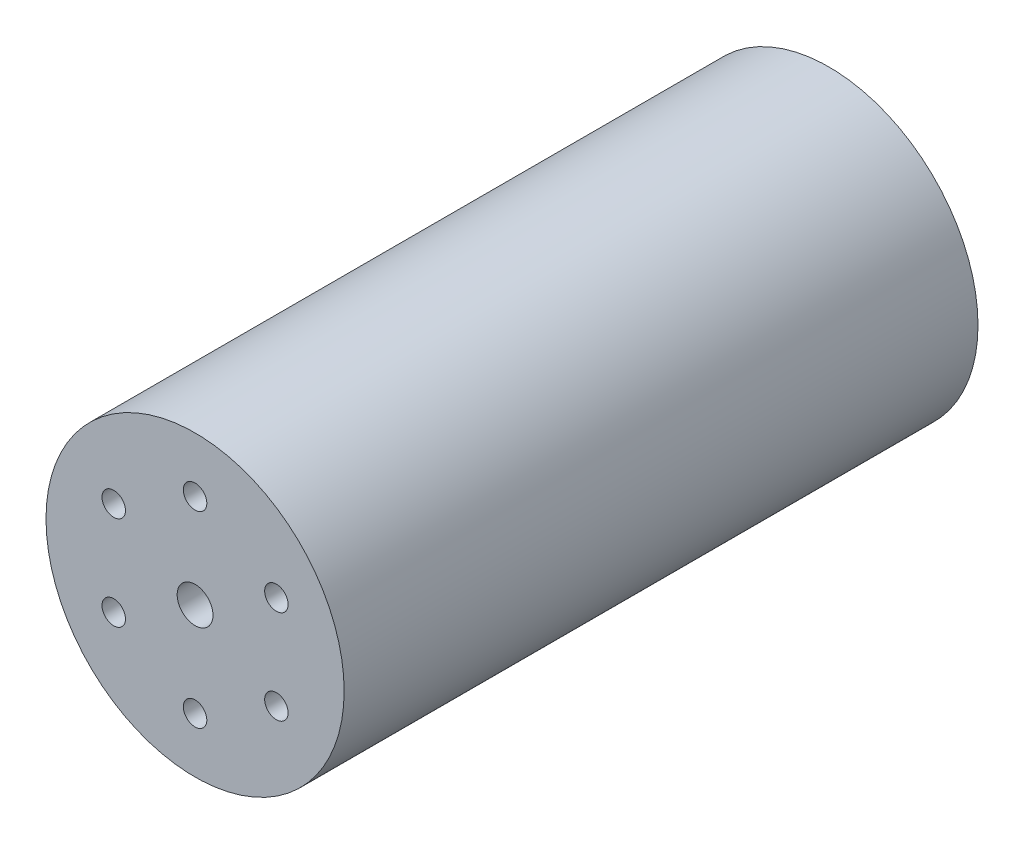
ISO-10303-21;
HEADER;
FILE_DESCRIPTION(('STEP AP214'),'2;1');
FILE_NAME('part.step','',(''),(''),'','','');
FILE_SCHEMA(('AUTOMOTIVE_DESIGN { 1 0 10303 214 1 1 1 1 }'));
ENDSEC;
DATA;
#1=APPLICATION_CONTEXT('core data for automotive mechanical design processes');
#2=APPLICATION_PROTOCOL_DEFINITION('international standard','automotive_design',2000,#1);
#3=PRODUCT_CONTEXT('',#1,'mechanical');
#4=PRODUCT('Part','Part','',(#3));
#5=PRODUCT_RELATED_PRODUCT_CATEGORY('part','',(#4));
#6=PRODUCT_DEFINITION_FORMATION('','',#4);
#7=PRODUCT_DEFINITION_CONTEXT('part definition',#1,'design');
#8=PRODUCT_DEFINITION('design','',#6,#7);
#9=PRODUCT_DEFINITION_SHAPE('','',#8);
#10=(LENGTH_UNIT() NAMED_UNIT(*) SI_UNIT(.MILLI.,.METRE.));
#11=(NAMED_UNIT(*) PLANE_ANGLE_UNIT() SI_UNIT($,.RADIAN.));
#12=(NAMED_UNIT(*) SI_UNIT($,.STERADIAN.) SOLID_ANGLE_UNIT());
#13=UNCERTAINTY_MEASURE_WITH_UNIT(LENGTH_MEASURE(1.E-05),#10,'distance_accuracy_value','');
#14=(GEOMETRIC_REPRESENTATION_CONTEXT(3) GLOBAL_UNCERTAINTY_ASSIGNED_CONTEXT((#13)) GLOBAL_UNIT_ASSIGNED_CONTEXT((#10,
#11,#12)) REPRESENTATION_CONTEXT('',''));
#15=CARTESIAN_POINT('',(0.,0.,0.));
#16=DIRECTION('',(0.,0.,1.));
#17=DIRECTION('',(1.,0.,0.));
#18=AXIS2_PLACEMENT_3D('',#15,#16,#17);
#19=CARTESIAN_POINT('',(0.,0.,135.));
#20=DIRECTION('',(0.,0.,-1.));
#21=DIRECTION('',(-1.,0.,0.));
#22=AXIS2_PLACEMENT_3D('',#19,#20,#21);
#23=CYLINDRICAL_SURFACE('',#22,3.815);
#24=CARTESIAN_POINT('',(0.,0.,135.));
#25=DIRECTION('',(0.,0.,-1.));
#26=DIRECTION('',(-1.,0.,0.));
#27=AXIS2_PLACEMENT_3D('',#24,#25,#26);
#28=CIRCLE('',#27,3.815);
#29=CARTESIAN_POINT('',(-3.815,0.,135.));
#30=VERTEX_POINT('',#29);
#31=EDGE_CURVE('E46',#30,#30,#28,.T.);
#32=ORIENTED_EDGE('',*,*,#31,.F.);
#33=EDGE_LOOP('',(#32));
#34=FACE_BOUND('',#33,.T.);
#35=CARTESIAN_POINT('',(0.,0.,30.));
#36=DIRECTION('',(0.,0.,-1.));
#37=DIRECTION('',(-1.,0.,0.));
#38=AXIS2_PLACEMENT_3D('',#35,#36,#37);
#39=CIRCLE('',#38,3.815);
#40=CARTESIAN_POINT('',(-3.815,0.,30.));
#41=VERTEX_POINT('',#40);
#42=EDGE_CURVE('E37',#41,#41,#39,.F.);
#43=ORIENTED_EDGE('',*,*,#42,.F.);
#44=EDGE_LOOP('',(#43));
#45=FACE_BOUND('',#44,.T.);
#46=ADVANCED_FACE('F33',(#34,#45),#23,.F.);
#47=CARTESIAN_POINT('',(0.,0.,135.));
#48=DIRECTION('',(0.,0.,-1.));
#49=DIRECTION('',(-1.,0.,0.));
#50=AXIS2_PLACEMENT_3D('',#47,#48,#49);
#51=CYLINDRICAL_SURFACE('',#50,31.75);
#52=CARTESIAN_POINT('',(0.,0.,135.));
#53=DIRECTION('',(0.,0.,1.));
#54=DIRECTION('',(1.,0.,0.));
#55=AXIS2_PLACEMENT_3D('',#52,#53,#54);
#56=CIRCLE('',#55,31.75);
#57=CARTESIAN_POINT('',(31.75,0.,135.));
#58=VERTEX_POINT('',#57);
#59=EDGE_CURVE('E10',#58,#58,#56,.T.);
#60=ORIENTED_EDGE('',*,*,#59,.F.);
#61=EDGE_LOOP('',(#60));
#62=FACE_BOUND('',#61,.T.);
#63=CARTESIAN_POINT('',(0.,0.,0.));
#64=DIRECTION('',(0.,0.,1.));
#65=DIRECTION('',(1.,0.,0.));
#66=AXIS2_PLACEMENT_3D('',#63,#64,#65);
#67=CIRCLE('',#66,31.75);
#68=CARTESIAN_POINT('',(31.75,0.,0.));
#69=VERTEX_POINT('',#68);
#70=EDGE_CURVE('E41',#69,#69,#67,.T.);
#71=ORIENTED_EDGE('',*,*,#70,.T.);
#72=EDGE_LOOP('',(#71));
#73=FACE_BOUND('',#72,.T.);
#74=ADVANCED_FACE('F35',(#62,#73),#51,.T.);
#75=CARTESIAN_POINT('',(0.,0.,135.));
#76=DIRECTION('',(0.,0.,1.));
#77=DIRECTION('',(1.,0.,0.));
#78=AXIS2_PLACEMENT_3D('',#75,#76,#77);
#79=PLANE('',#78);
#80=CARTESIAN_POINT('',(-17.3205080756884,9.99999999999925,135.));
#81=DIRECTION('',(0.,0.,1.));
#82=DIRECTION('',(1.,0.,0.));
#83=AXIS2_PLACEMENT_3D('',#80,#81,#82);
#84=CIRCLE('',#83,2.50000000000086);
#85=CARTESIAN_POINT('',(-14.8205080756875,9.99999999999925,135.));
#86=VERTEX_POINT('',#85);
#87=EDGE_CURVE('E87',#86,#86,#84,.T.);
#88=ORIENTED_EDGE('',*,*,#87,.F.);
#89=EDGE_LOOP('',(#88));
#90=FACE_BOUND('',#89,.T.);
#91=CARTESIAN_POINT('',(-17.3205080756875,-10.0000000000007,135.));
#92=DIRECTION('',(0.,0.,1.));
#93=DIRECTION('',(1.,0.,0.));
#94=AXIS2_PLACEMENT_3D('',#91,#92,#93);
#95=CIRCLE('',#94,2.50000000000161);
#96=CARTESIAN_POINT('',(-14.8205080756859,-10.0000000000007,135.));
#97=VERTEX_POINT('',#96);
#98=EDGE_CURVE('E63',#97,#97,#95,.T.);
#99=ORIENTED_EDGE('',*,*,#98,.F.);
#100=EDGE_LOOP('',(#99));
#101=FACE_BOUND('',#100,.T.);
#102=CARTESIAN_POINT('',(1.70040397862765E-12,-20.,135.));
#103=DIRECTION('',(0.,0.,1.));
#104=DIRECTION('',(1.,0.,0.));
#105=AXIS2_PLACEMENT_3D('',#102,#103,#104);
#106=CIRCLE('',#105,2.50000000000176);
#107=CARTESIAN_POINT('',(2.50000000000346,-20.,135.));
#108=VERTEX_POINT('',#107);
#109=EDGE_CURVE('E70',#108,#108,#106,.T.);
#110=ORIENTED_EDGE('',*,*,#109,.F.);
#111=EDGE_LOOP('',(#110));
#112=FACE_BOUND('',#111,.T.);
#113=CARTESIAN_POINT('',(17.3205080756901,-9.99999999999926,135.));
#114=DIRECTION('',(0.,0.,1.));
#115=DIRECTION('',(1.,0.,0.));
#116=AXIS2_PLACEMENT_3D('',#113,#114,#115);
#117=CIRCLE('',#116,2.5000000000011);
#118=CARTESIAN_POINT('',(19.8205080756911,-9.99999999999926,135.));
#119=VERTEX_POINT('',#118);
#120=EDGE_CURVE('E76',#119,#119,#117,.T.);
#121=ORIENTED_EDGE('',*,*,#120,.F.);
#122=EDGE_LOOP('',(#121));
#123=FACE_BOUND('',#122,.T.);
#124=CARTESIAN_POINT('',(17.3205080756892,10.0000000000007,135.));
#125=DIRECTION('',(0.,0.,1.));
#126=DIRECTION('',(1.,0.,0.));
#127=AXIS2_PLACEMENT_3D('',#124,#125,#126);
#128=CIRCLE('',#127,2.50000000000024);
#129=CARTESIAN_POINT('',(19.8205080756894,10.0000000000007,135.));
#130=VERTEX_POINT('',#129);
#131=EDGE_CURVE('E82',#130,#130,#128,.T.);
#132=ORIENTED_EDGE('',*,*,#131,.F.);
#133=EDGE_LOOP('',(#132));
#134=FACE_BOUND('',#133,.T.);
#135=CARTESIAN_POINT('',(0.,20.,135.));
#136=DIRECTION('',(0.,0.,1.));
#137=DIRECTION('',(1.,0.,0.));
#138=AXIS2_PLACEMENT_3D('',#135,#136,#137);
#139=CIRCLE('',#138,2.5);
#140=CARTESIAN_POINT('',(2.5,20.,135.));
#141=VERTEX_POINT('',#140);
#142=EDGE_CURVE('E57',#141,#141,#139,.T.);
#143=ORIENTED_EDGE('',*,*,#142,.F.);
#144=EDGE_LOOP('',(#143));
#145=FACE_BOUND('',#144,.T.);
#146=ORIENTED_EDGE('',*,*,#31,.T.);
#147=EDGE_LOOP('',(#146));
#148=FACE_BOUND('',#147,.T.);
#149=ORIENTED_EDGE('',*,*,#59,.T.);
#150=EDGE_LOOP('',(#149));
#151=FACE_BOUND('',#150,.T.);
#152=ADVANCED_FACE('F102',(#90,#101,#112,#123,#134,#145,#148,#151),#79,.T.);
#153=CARTESIAN_POINT('',(0.,0.,0.));
#154=DIRECTION('',(0.,0.,1.));
#155=DIRECTION('',(1.,0.,0.));
#156=AXIS2_PLACEMENT_3D('',#153,#154,#155);
#157=PLANE('',#156);
#158=CARTESIAN_POINT('',(0.,0.,0.));
#159=DIRECTION('',(0.,0.,-1.));
#160=DIRECTION('',(-1.,0.,0.));
#161=AXIS2_PLACEMENT_3D('',#158,#159,#160);
#162=CIRCLE('',#161,22.225);
#163=CARTESIAN_POINT('',(-22.225,0.,0.));
#164=VERTEX_POINT('',#163);
#165=EDGE_CURVE('E50',#164,#164,#162,.T.);
#166=ORIENTED_EDGE('',*,*,#165,.F.);
#167=EDGE_LOOP('',(#166));
#168=FACE_BOUND('',#167,.T.);
#169=ORIENTED_EDGE('',*,*,#70,.F.);
#170=EDGE_LOOP('',(#169));
#171=FACE_BOUND('',#170,.T.);
#172=ADVANCED_FACE('F105',(#168,#171),#157,.F.);
#173=CARTESIAN_POINT('',(0.,0.,30.));
#174=DIRECTION('',(0.,0.,-1.));
#175=DIRECTION('',(-1.,0.,0.));
#176=AXIS2_PLACEMENT_3D('',#173,#174,#175);
#177=PLANE('',#176);
#178=CARTESIAN_POINT('',(0.,0.,30.));
#179=DIRECTION('',(0.,0.,-1.));
#180=DIRECTION('',(-1.,0.,0.));
#181=AXIS2_PLACEMENT_3D('',#178,#179,#180);
#182=CIRCLE('',#181,22.225);
#183=CARTESIAN_POINT('',(-22.225,0.,30.));
#184=VERTEX_POINT('',#183);
#185=EDGE_CURVE('E53',#184,#184,#182,.T.);
#186=ORIENTED_EDGE('',*,*,#185,.T.);
#187=EDGE_LOOP('',(#186));
#188=FACE_BOUND('',#187,.T.);
#189=ORIENTED_EDGE('',*,*,#42,.T.);
#190=EDGE_LOOP('',(#189));
#191=FACE_BOUND('',#190,.T.);
#192=ADVANCED_FACE('F125',(#188,#191),#177,.T.);
#193=CARTESIAN_POINT('',(0.,0.,30.));
#194=DIRECTION('',(0.,0.,-1.));
#195=DIRECTION('',(-1.,0.,0.));
#196=AXIS2_PLACEMENT_3D('',#193,#194,#195);
#197=CYLINDRICAL_SURFACE('',#196,22.225);
#198=ORIENTED_EDGE('',*,*,#185,.F.);
#199=EDGE_LOOP('',(#198));
#200=FACE_BOUND('',#199,.T.);
#201=ORIENTED_EDGE('',*,*,#165,.T.);
#202=EDGE_LOOP('',(#201));
#203=FACE_BOUND('',#202,.T.);
#204=ADVANCED_FACE('F127',(#200,#203),#197,.F.);
#205=CARTESIAN_POINT('',(0.,20.,130.));
#206=DIRECTION('',(0.,0.,1.));
#207=DIRECTION('',(1.,0.,0.));
#208=AXIS2_PLACEMENT_3D('',#205,#206,#207);
#209=CYLINDRICAL_SURFACE('',#208,2.5);
#210=CARTESIAN_POINT('',(0.,20.,130.));
#211=DIRECTION('',(0.,0.,1.));
#212=DIRECTION('',(1.,0.,0.));
#213=AXIS2_PLACEMENT_3D('',#210,#211,#212);
#214=CIRCLE('',#213,2.5);
#215=CARTESIAN_POINT('',(2.5,20.,130.));
#216=VERTEX_POINT('',#215);
#217=EDGE_CURVE('E54',#216,#216,#214,.T.);
#218=ORIENTED_EDGE('',*,*,#217,.F.);
#219=EDGE_LOOP('',(#218));
#220=FACE_BOUND('',#219,.T.);
#221=ORIENTED_EDGE('',*,*,#142,.T.);
#222=EDGE_LOOP('',(#221));
#223=FACE_BOUND('',#222,.T.);
#224=ADVANCED_FACE('F134',(#220,#223),#209,.F.);
#225=CARTESIAN_POINT('',(0.,20.,130.));
#226=DIRECTION('',(0.,0.,1.));
#227=DIRECTION('',(1.,0.,0.));
#228=AXIS2_PLACEMENT_3D('',#225,#226,#227);
#229=PLANE('',#228);
#230=ORIENTED_EDGE('',*,*,#217,.T.);
#231=EDGE_LOOP('',(#230));
#232=FACE_BOUND('',#231,.T.);
#233=ADVANCED_FACE('F141',(#232),#229,.T.);
#234=CARTESIAN_POINT('',(17.3205080756892,10.0000000000007,130.));
#235=DIRECTION('',(0.,0.,1.));
#236=DIRECTION('',(1.,0.,0.));
#237=AXIS2_PLACEMENT_3D('',#234,#235,#236);
#238=CYLINDRICAL_SURFACE('',#237,2.50000000000024);
#239=CARTESIAN_POINT('',(17.3205080756892,10.0000000000007,130.));
#240=DIRECTION('',(0.,0.,1.));
#241=DIRECTION('',(1.,0.,0.));
#242=AXIS2_PLACEMENT_3D('',#239,#240,#241);
#243=CIRCLE('',#242,2.50000000000024);
#244=CARTESIAN_POINT('',(19.8205080756894,10.0000000000007,130.));
#245=VERTEX_POINT('',#244);
#246=EDGE_CURVE('E60',#245,#245,#243,.T.);
#247=ORIENTED_EDGE('',*,*,#246,.F.);
#248=EDGE_LOOP('',(#247));
#249=FACE_BOUND('',#248,.T.);
#250=ORIENTED_EDGE('',*,*,#131,.T.);
#251=EDGE_LOOP('',(#250));
#252=FACE_BOUND('',#251,.T.);
#253=ADVANCED_FACE('F145',(#249,#252),#238,.F.);
#254=CARTESIAN_POINT('',(17.3205080756892,10.0000000000007,130.));
#255=DIRECTION('',(0.,0.,1.));
#256=DIRECTION('',(1.,0.,0.));
#257=AXIS2_PLACEMENT_3D('',#254,#255,#256);
#258=PLANE('',#257);
#259=ORIENTED_EDGE('',*,*,#246,.T.);
#260=EDGE_LOOP('',(#259));
#261=FACE_BOUND('',#260,.T.);
#262=ADVANCED_FACE('F166',(#261),#258,.T.);
#263=CARTESIAN_POINT('',(17.3205080756901,-9.99999999999926,130.));
#264=DIRECTION('',(0.,0.,1.));
#265=DIRECTION('',(1.,0.,0.));
#266=AXIS2_PLACEMENT_3D('',#263,#264,#265);
#267=CYLINDRICAL_SURFACE('',#266,2.5000000000011);
#268=CARTESIAN_POINT('',(17.3205080756901,-9.99999999999926,130.));
#269=DIRECTION('',(0.,0.,1.));
#270=DIRECTION('',(1.,0.,0.));
#271=AXIS2_PLACEMENT_3D('',#268,#269,#270);
#272=CIRCLE('',#271,2.5000000000011);
#273=CARTESIAN_POINT('',(19.8205080756911,-9.99999999999926,130.));
#274=VERTEX_POINT('',#273);
#275=EDGE_CURVE('E79',#274,#274,#272,.T.);
#276=ORIENTED_EDGE('',*,*,#275,.F.);
#277=EDGE_LOOP('',(#276));
#278=FACE_BOUND('',#277,.T.);
#279=ORIENTED_EDGE('',*,*,#120,.T.);
#280=EDGE_LOOP('',(#279));
#281=FACE_BOUND('',#280,.T.);
#282=ADVANCED_FACE('F163',(#278,#281),#267,.F.);
#283=CARTESIAN_POINT('',(17.3205080756901,-9.99999999999926,130.));
#284=DIRECTION('',(0.,0.,1.));
#285=DIRECTION('',(1.,0.,0.));
#286=AXIS2_PLACEMENT_3D('',#283,#284,#285);
#287=PLANE('',#286);
#288=ORIENTED_EDGE('',*,*,#275,.T.);
#289=EDGE_LOOP('',(#288));
#290=FACE_BOUND('',#289,.T.);
#291=ADVANCED_FACE('F158',(#290),#287,.T.);
#292=CARTESIAN_POINT('',(1.70040397862765E-12,-20.,130.));
#293=DIRECTION('',(0.,0.,1.));
#294=DIRECTION('',(1.,0.,0.));
#295=AXIS2_PLACEMENT_3D('',#292,#293,#294);
#296=CYLINDRICAL_SURFACE('',#295,2.50000000000176);
#297=CARTESIAN_POINT('',(1.70040397862765E-12,-20.,130.));
#298=DIRECTION('',(0.,0.,1.));
#299=DIRECTION('',(1.,0.,0.));
#300=AXIS2_PLACEMENT_3D('',#297,#298,#299);
#301=CIRCLE('',#300,2.50000000000176);
#302=CARTESIAN_POINT('',(2.50000000000346,-20.,130.));
#303=VERTEX_POINT('',#302);
#304=EDGE_CURVE('E73',#303,#303,#301,.T.);
#305=ORIENTED_EDGE('',*,*,#304,.F.);
#306=EDGE_LOOP('',(#305));
#307=FACE_BOUND('',#306,.T.);
#308=ORIENTED_EDGE('',*,*,#109,.T.);
#309=EDGE_LOOP('',(#308));
#310=FACE_BOUND('',#309,.T.);
#311=ADVANCED_FACE('F155',(#307,#310),#296,.F.);
#312=CARTESIAN_POINT('',(1.70040397862765E-12,-20.,130.));
#313=DIRECTION('',(0.,0.,1.));
#314=DIRECTION('',(1.,0.,0.));
#315=AXIS2_PLACEMENT_3D('',#312,#313,#314);
#316=PLANE('',#315);
#317=ORIENTED_EDGE('',*,*,#304,.T.);
#318=EDGE_LOOP('',(#317));
#319=FACE_BOUND('',#318,.T.);
#320=ADVANCED_FACE('F150',(#319),#316,.T.);
#321=CARTESIAN_POINT('',(-17.3205080756875,-10.0000000000007,130.));
#322=DIRECTION('',(0.,0.,1.));
#323=DIRECTION('',(1.,0.,0.));
#324=AXIS2_PLACEMENT_3D('',#321,#322,#323);
#325=CYLINDRICAL_SURFACE('',#324,2.50000000000161);
#326=CARTESIAN_POINT('',(-17.3205080756875,-10.0000000000007,130.));
#327=DIRECTION('',(0.,0.,1.));
#328=DIRECTION('',(1.,0.,0.));
#329=AXIS2_PLACEMENT_3D('',#326,#327,#328);
#330=CIRCLE('',#329,2.50000000000161);
#331=CARTESIAN_POINT('',(-14.8205080756859,-10.0000000000007,130.));
#332=VERTEX_POINT('',#331);
#333=EDGE_CURVE('E66',#332,#332,#330,.T.);
#334=ORIENTED_EDGE('',*,*,#333,.F.);
#335=EDGE_LOOP('',(#334));
#336=FACE_BOUND('',#335,.T.);
#337=ORIENTED_EDGE('',*,*,#98,.T.);
#338=EDGE_LOOP('',(#337));
#339=FACE_BOUND('',#338,.T.);
#340=ADVANCED_FACE('F147',(#336,#339),#325,.F.);
#341=CARTESIAN_POINT('',(-17.3205080756875,-10.0000000000007,130.));
#342=DIRECTION('',(0.,0.,1.));
#343=DIRECTION('',(1.,0.,0.));
#344=AXIS2_PLACEMENT_3D('',#341,#342,#343);
#345=PLANE('',#344);
#346=ORIENTED_EDGE('',*,*,#333,.T.);
#347=EDGE_LOOP('',(#346));
#348=FACE_BOUND('',#347,.T.);
#349=ADVANCED_FACE('F98',(#348),#345,.T.);
#350=CARTESIAN_POINT('',(-17.3205080756884,9.99999999999925,130.));
#351=DIRECTION('',(0.,0.,1.));
#352=DIRECTION('',(1.,0.,0.));
#353=AXIS2_PLACEMENT_3D('',#350,#351,#352);
#354=CYLINDRICAL_SURFACE('',#353,2.50000000000086);
#355=CARTESIAN_POINT('',(-17.3205080756884,9.99999999999925,130.));
#356=DIRECTION('',(0.,0.,1.));
#357=DIRECTION('',(1.,0.,0.));
#358=AXIS2_PLACEMENT_3D('',#355,#356,#357);
#359=CIRCLE('',#358,2.50000000000086);
#360=CARTESIAN_POINT('',(-14.8205080756875,9.99999999999925,130.));
#361=VERTEX_POINT('',#360);
#362=EDGE_CURVE('E67',#361,#361,#359,.T.);
#363=ORIENTED_EDGE('',*,*,#362,.F.);
#364=EDGE_LOOP('',(#363));
#365=FACE_BOUND('',#364,.T.);
#366=ORIENTED_EDGE('',*,*,#87,.T.);
#367=EDGE_LOOP('',(#366));
#368=FACE_BOUND('',#367,.T.);
#369=ADVANCED_FACE('F95',(#365,#368),#354,.F.);
#370=CARTESIAN_POINT('',(-17.3205080756884,9.99999999999925,130.));
#371=DIRECTION('',(0.,0.,1.));
#372=DIRECTION('',(1.,0.,0.));
#373=AXIS2_PLACEMENT_3D('',#370,#371,#372);
#374=PLANE('',#373);
#375=ORIENTED_EDGE('',*,*,#362,.T.);
#376=EDGE_LOOP('',(#375));
#377=FACE_BOUND('',#376,.T.);
#378=ADVANCED_FACE('F93',(#377),#374,.T.);
#379=CLOSED_SHELL('',(#46,#74,#152,#172,#192,#204,#224,#233,#253,#262,#282,#291,#311,#320,#340,
#349,#369,#378));
#380=MANIFOLD_SOLID_BREP('B2',#379);
#381=ADVANCED_BREP_SHAPE_REPRESENTATION('',(#18,#380),#14);
#382=SHAPE_DEFINITION_REPRESENTATION(#9,#381);
ENDSEC;
END-ISO-10303-21;
